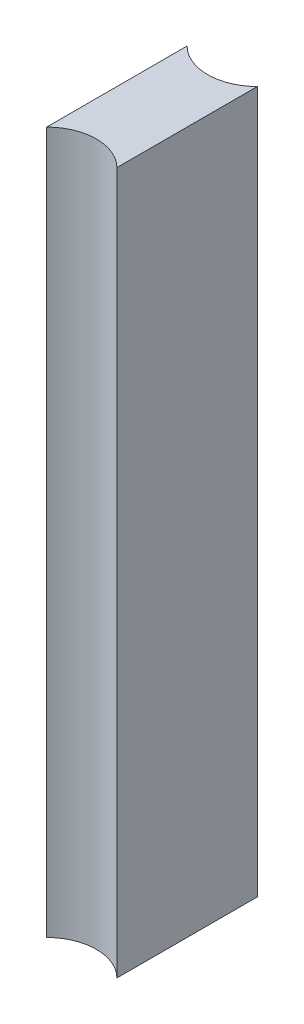
ISO-10303-21;
HEADER;
FILE_DESCRIPTION(('STEP AP214'),'2;1');
FILE_NAME('part.step','',(''),(''),'','','');
FILE_SCHEMA(('AUTOMOTIVE_DESIGN { 1 0 10303 214 1 1 1 1 }'));
ENDSEC;
DATA;
#1=APPLICATION_CONTEXT('core data for automotive mechanical design processes');
#2=APPLICATION_PROTOCOL_DEFINITION('international standard','automotive_design',2000,#1);
#3=PRODUCT_CONTEXT('',#1,'mechanical');
#4=PRODUCT('Part','Part','',(#3));
#5=PRODUCT_RELATED_PRODUCT_CATEGORY('part','',(#4));
#6=PRODUCT_DEFINITION_FORMATION('','',#4);
#7=PRODUCT_DEFINITION_CONTEXT('part definition',#1,'design');
#8=PRODUCT_DEFINITION('design','',#6,#7);
#9=PRODUCT_DEFINITION_SHAPE('','',#8);
#10=(LENGTH_UNIT() NAMED_UNIT(*) SI_UNIT(.MILLI.,.METRE.));
#11=(NAMED_UNIT(*) PLANE_ANGLE_UNIT() SI_UNIT($,.RADIAN.));
#12=(NAMED_UNIT(*) SI_UNIT($,.STERADIAN.) SOLID_ANGLE_UNIT());
#13=UNCERTAINTY_MEASURE_WITH_UNIT(LENGTH_MEASURE(1.E-05),#10,'distance_accuracy_value','');
#14=(GEOMETRIC_REPRESENTATION_CONTEXT(3) GLOBAL_UNCERTAINTY_ASSIGNED_CONTEXT((#13)) GLOBAL_UNIT_ASSIGNED_CONTEXT((#10,
#11,#12)) REPRESENTATION_CONTEXT('',''));
#15=CARTESIAN_POINT('',(0.,0.,0.));
#16=DIRECTION('',(0.,0.,1.));
#17=DIRECTION('',(1.,0.,0.));
#18=AXIS2_PLACEMENT_3D('',#15,#16,#17);
#19=CARTESIAN_POINT('',(0.,1.5,0.225));
#20=DIRECTION('',(0.,-1.,0.));
#21=DIRECTION('',(0.,0.,-1.));
#22=AXIS2_PLACEMENT_3D('',#19,#20,#21);
#23=CYLINDRICAL_SURFACE('',#22,0.106066017177982);
#24=CARTESIAN_POINT('',(0.,0.,0.225));
#25=DIRECTION('',(0.,1.,0.));
#26=DIRECTION('',(0.,0.,1.));
#27=AXIS2_PLACEMENT_3D('',#24,#25,#26);
#28=CIRCLE('',#27,0.106066017177982);
#29=CARTESIAN_POINT('',(0.075,0.,0.15));
#30=VERTEX_POINT('',#29);
#31=CARTESIAN_POINT('',(-0.075,0.,0.15));
#32=VERTEX_POINT('',#31);
#33=EDGE_CURVE('E120',#30,#32,#28,.T.);
#34=ORIENTED_EDGE('',*,*,#33,.F.);
#35=DIRECTION('',(0.,-1.,0.));
#36=VECTOR('',#35,1.);
#37=CARTESIAN_POINT('',(0.075,1.5,0.15));
#38=LINE('',#37,#36);
#39=CARTESIAN_POINT('',(0.075,1.5,0.15));
#40=VERTEX_POINT('',#39);
#41=EDGE_CURVE('E11',#40,#30,#38,.T.);
#42=ORIENTED_EDGE('',*,*,#41,.F.);
#43=CARTESIAN_POINT('',(0.,1.5,0.225));
#44=DIRECTION('',(0.,1.,0.));
#45=DIRECTION('',(0.,0.,1.));
#46=AXIS2_PLACEMENT_3D('',#43,#44,#45);
#47=CIRCLE('',#46,0.106066017177982);
#48=CARTESIAN_POINT('',(-0.075,1.5,0.15));
#49=VERTEX_POINT('',#48);
#50=EDGE_CURVE('E111',#40,#49,#47,.T.);
#51=ORIENTED_EDGE('',*,*,#50,.T.);
#52=DIRECTION('',(0.,-1.,0.));
#53=VECTOR('',#52,1.);
#54=CARTESIAN_POINT('',(-0.075,1.5,0.15));
#55=LINE('',#54,#53);
#56=EDGE_CURVE('E89',#49,#32,#55,.T.);
#57=ORIENTED_EDGE('',*,*,#56,.T.);
#58=EDGE_LOOP('',(#34,#42,#51,#57));
#59=FACE_BOUND('',#58,.T.);
#60=ADVANCED_FACE('F43',(#59),#23,.F.);
#61=CARTESIAN_POINT('',(0.075,1.5,0.));
#62=DIRECTION('',(1.,0.,0.));
#63=DIRECTION('',(0.,0.,-1.));
#64=AXIS2_PLACEMENT_3D('',#61,#62,#63);
#65=PLANE('',#64);
#66=DIRECTION('',(0.,0.,1.));
#67=VECTOR('',#66,1.);
#68=CARTESIAN_POINT('',(0.075,0.,0.));
#69=LINE('',#68,#67);
#70=CARTESIAN_POINT('',(0.0749999999999999,0.,-0.15));
#71=VERTEX_POINT('',#70);
#72=EDGE_CURVE('E103',#71,#30,#69,.T.);
#73=ORIENTED_EDGE('',*,*,#72,.F.);
#74=DIRECTION('',(0.,-1.,0.));
#75=VECTOR('',#74,1.);
#76=CARTESIAN_POINT('',(0.0749999999999999,1.5,-0.15));
#77=LINE('',#76,#75);
#78=CARTESIAN_POINT('',(0.0749999999999999,1.5,-0.15));
#79=VERTEX_POINT('',#78);
#80=EDGE_CURVE('E52',#79,#71,#77,.T.);
#81=ORIENTED_EDGE('',*,*,#80,.F.);
#82=DIRECTION('',(0.,0.,1.));
#83=VECTOR('',#82,1.);
#84=CARTESIAN_POINT('',(0.075,1.5,0.));
#85=LINE('',#84,#83);
#86=EDGE_CURVE('E101',#79,#40,#85,.T.);
#87=ORIENTED_EDGE('',*,*,#86,.T.);
#88=ORIENTED_EDGE('',*,*,#41,.T.);
#89=EDGE_LOOP('',(#73,#81,#87,#88));
#90=FACE_BOUND('',#89,.T.);
#91=ADVANCED_FACE('F99',(#90),#65,.T.);
#92=CARTESIAN_POINT('',(0.,1.5,-0.225));
#93=DIRECTION('',(0.,-1.,0.));
#94=DIRECTION('',(0.,0.,-1.));
#95=AXIS2_PLACEMENT_3D('',#92,#93,#94);
#96=CYLINDRICAL_SURFACE('',#95,0.106066017177982);
#97=CARTESIAN_POINT('',(0.,0.,-0.225));
#98=DIRECTION('',(0.,1.,0.));
#99=DIRECTION('',(0.,0.,1.));
#100=AXIS2_PLACEMENT_3D('',#97,#98,#99);
#101=CIRCLE('',#100,0.106066017177982);
#102=CARTESIAN_POINT('',(-0.0750000000000001,0.,-0.15));
#103=VERTEX_POINT('',#102);
#104=EDGE_CURVE('E82',#71,#103,#101,.F.);
#105=ORIENTED_EDGE('',*,*,#104,.T.);
#106=DIRECTION('',(0.,-1.,0.));
#107=VECTOR('',#106,1.);
#108=CARTESIAN_POINT('',(-0.0750000000000001,1.5,-0.15));
#109=LINE('',#108,#107);
#110=CARTESIAN_POINT('',(-0.0750000000000001,1.5,-0.15));
#111=VERTEX_POINT('',#110);
#112=EDGE_CURVE('E105',#111,#103,#109,.T.);
#113=ORIENTED_EDGE('',*,*,#112,.F.);
#114=CARTESIAN_POINT('',(0.,1.5,-0.225));
#115=DIRECTION('',(0.,1.,0.));
#116=DIRECTION('',(0.,0.,1.));
#117=AXIS2_PLACEMENT_3D('',#114,#115,#116);
#118=CIRCLE('',#117,0.106066017177982);
#119=EDGE_CURVE('E106',#79,#111,#118,.F.);
#120=ORIENTED_EDGE('',*,*,#119,.F.);
#121=ORIENTED_EDGE('',*,*,#80,.T.);
#122=EDGE_LOOP('',(#105,#113,#120,#121));
#123=FACE_BOUND('',#122,.T.);
#124=ADVANCED_FACE('F107',(#123),#96,.F.);
#125=CARTESIAN_POINT('',(-0.075,1.5,0.));
#126=DIRECTION('',(1.,0.,0.));
#127=DIRECTION('',(0.,0.,-1.));
#128=AXIS2_PLACEMENT_3D('',#125,#126,#127);
#129=PLANE('',#128);
#130=DIRECTION('',(0.,0.,1.));
#131=VECTOR('',#130,1.);
#132=CARTESIAN_POINT('',(-0.075,0.,0.));
#133=LINE('',#132,#131);
#134=EDGE_CURVE('E115',#103,#32,#133,.T.);
#135=ORIENTED_EDGE('',*,*,#134,.T.);
#136=ORIENTED_EDGE('',*,*,#56,.F.);
#137=DIRECTION('',(0.,0.,1.));
#138=VECTOR('',#137,1.);
#139=CARTESIAN_POINT('',(-0.075,1.5,0.));
#140=LINE('',#139,#138);
#141=EDGE_CURVE('E62',#111,#49,#140,.T.);
#142=ORIENTED_EDGE('',*,*,#141,.F.);
#143=ORIENTED_EDGE('',*,*,#112,.T.);
#144=EDGE_LOOP('',(#135,#136,#142,#143));
#145=FACE_BOUND('',#144,.T.);
#146=ADVANCED_FACE('F135',(#145),#129,.F.);
#147=CARTESIAN_POINT('',(0.,1.5,0.));
#148=DIRECTION('',(0.,1.,0.));
#149=DIRECTION('',(0.,0.,1.));
#150=AXIS2_PLACEMENT_3D('',#147,#148,#149);
#151=PLANE('',#150);
#152=ORIENTED_EDGE('',*,*,#50,.F.);
#153=ORIENTED_EDGE('',*,*,#86,.F.);
#154=ORIENTED_EDGE('',*,*,#119,.T.);
#155=ORIENTED_EDGE('',*,*,#141,.T.);
#156=EDGE_LOOP('',(#152,#153,#154,#155));
#157=FACE_BOUND('',#156,.T.);
#158=ADVANCED_FACE('F110',(#157),#151,.T.);
#159=CARTESIAN_POINT('',(0.,0.,0.));
#160=DIRECTION('',(0.,1.,0.));
#161=DIRECTION('',(0.,0.,1.));
#162=AXIS2_PLACEMENT_3D('',#159,#160,#161);
#163=PLANE('',#162);
#164=ORIENTED_EDGE('',*,*,#33,.T.);
#165=ORIENTED_EDGE('',*,*,#134,.F.);
#166=ORIENTED_EDGE('',*,*,#104,.F.);
#167=ORIENTED_EDGE('',*,*,#72,.T.);
#168=EDGE_LOOP('',(#164,#165,#166,#167));
#169=FACE_BOUND('',#168,.T.);
#170=ADVANCED_FACE('F137',(#169),#163,.F.);
#171=CLOSED_SHELL('',(#60,#91,#124,#146,#158,#170));
#172=MANIFOLD_SOLID_BREP('B2',#171);
#173=ADVANCED_BREP_SHAPE_REPRESENTATION('',(#18,#172),#14);
#174=SHAPE_DEFINITION_REPRESENTATION(#9,#173);
ENDSEC;
END-ISO-10303-21;
